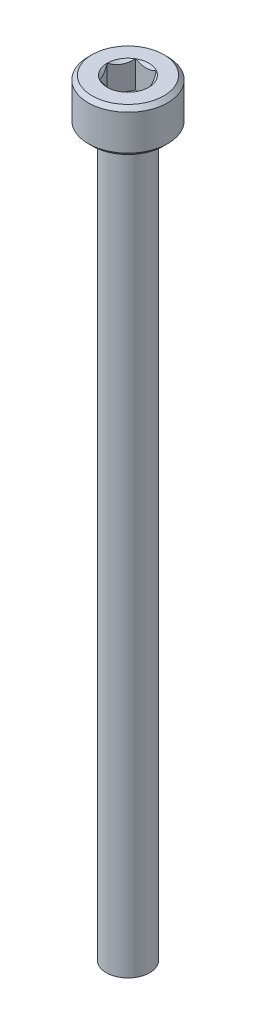
ISO-10303-21;
HEADER;
FILE_DESCRIPTION(('STEP AP214'),'2;1');
FILE_NAME('part.step','',(''),(''),'','','');
FILE_SCHEMA(('AUTOMOTIVE_DESIGN { 1 0 10303 214 1 1 1 1 }'));
ENDSEC;
DATA;
#1=APPLICATION_CONTEXT('core data for automotive mechanical design processes');
#2=APPLICATION_PROTOCOL_DEFINITION('international standard','automotive_design',2000,#1);
#3=PRODUCT_CONTEXT('',#1,'mechanical');
#4=PRODUCT('Part','Part','',(#3));
#5=PRODUCT_RELATED_PRODUCT_CATEGORY('part','',(#4));
#6=PRODUCT_DEFINITION_FORMATION('','',#4);
#7=PRODUCT_DEFINITION_CONTEXT('part definition',#1,'design');
#8=PRODUCT_DEFINITION('design','',#6,#7);
#9=PRODUCT_DEFINITION_SHAPE('','',#8);
#10=(LENGTH_UNIT() NAMED_UNIT(*) SI_UNIT(.MILLI.,.METRE.));
#11=(NAMED_UNIT(*) PLANE_ANGLE_UNIT() SI_UNIT($,.RADIAN.));
#12=(NAMED_UNIT(*) SI_UNIT($,.STERADIAN.) SOLID_ANGLE_UNIT());
#13=UNCERTAINTY_MEASURE_WITH_UNIT(LENGTH_MEASURE(1.E-05),#10,'distance_accuracy_value','');
#14=(GEOMETRIC_REPRESENTATION_CONTEXT(3) GLOBAL_UNCERTAINTY_ASSIGNED_CONTEXT((#13)) GLOBAL_UNIT_ASSIGNED_CONTEXT((#10,
#11,#12)) REPRESENTATION_CONTEXT('',''));
#15=CARTESIAN_POINT('',(0.,0.,0.));
#16=DIRECTION('',(0.,0.,1.));
#17=DIRECTION('',(1.,0.,0.));
#18=AXIS2_PLACEMENT_3D('',#15,#16,#17);
#19=CARTESIAN_POINT('',(0.,3.,0.));
#20=DIRECTION('',(0.,-1.,0.));
#21=DIRECTION('',(0.,0.,-1.));
#22=AXIS2_PLACEMENT_3D('',#19,#20,#21);
#23=CYLINDRICAL_SURFACE('',#22,2.75);
#24=CARTESIAN_POINT('',(0.,0.275000000000001,0.));
#25=DIRECTION('',(0.,1.,0.));
#26=DIRECTION('',(0.,0.,1.));
#27=AXIS2_PLACEMENT_3D('',#24,#25,#26);
#28=CIRCLE('',#27,2.75);
#29=CARTESIAN_POINT('',(0.,0.275000000000001,2.75));
#30=VERTEX_POINT('',#29);
#31=EDGE_CURVE('E222',#30,#30,#28,.T.);
#32=ORIENTED_EDGE('',*,*,#31,.T.);
#33=EDGE_LOOP('',(#32));
#34=FACE_BOUND('',#33,.T.);
#35=CARTESIAN_POINT('',(0.,2.725,0.));
#36=DIRECTION('',(0.,1.,0.));
#37=DIRECTION('',(0.,0.,1.));
#38=AXIS2_PLACEMENT_3D('',#35,#36,#37);
#39=CIRCLE('',#38,2.75);
#40=CARTESIAN_POINT('',(0.,2.725,2.75));
#41=VERTEX_POINT('',#40);
#42=EDGE_CURVE('E105',#41,#41,#39,.F.);
#43=ORIENTED_EDGE('',*,*,#42,.T.);
#44=EDGE_LOOP('',(#43));
#45=FACE_BOUND('',#44,.T.);
#46=ADVANCED_FACE('F33',(#34,#45),#23,.T.);
#47=CARTESIAN_POINT('',(0.,3.,0.));
#48=DIRECTION('',(0.,1.,0.));
#49=DIRECTION('',(0.,0.,1.));
#50=AXIS2_PLACEMENT_3D('',#47,#48,#49);
#51=PLANE('',#50);
#52=CARTESIAN_POINT('',(0.,3.,0.));
#53=DIRECTION('',(0.,1.,0.));
#54=DIRECTION('',(0.,0.,1.));
#55=AXIS2_PLACEMENT_3D('',#52,#53,#54);
#56=CIRCLE('',#55,2.475);
#57=CARTESIAN_POINT('',(0.,3.,2.475));
#58=VERTEX_POINT('',#57);
#59=EDGE_CURVE('E37',#58,#58,#56,.T.);
#60=ORIENTED_EDGE('',*,*,#59,.T.);
#61=EDGE_LOOP('',(#60));
#62=FACE_BOUND('',#61,.T.);
#63=CARTESIAN_POINT('',(0.,3.,0.));
#64=DIRECTION('',(0.,1.,0.));
#65=DIRECTION('',(0.,0.,1.));
#66=AXIS2_PLACEMENT_3D('',#63,#64,#65);
#67=CIRCLE('',#66,1.44337567297406);
#68=CARTESIAN_POINT('',(0.721687836487033,3.,1.25));
#69=VERTEX_POINT('',#68);
#70=CARTESIAN_POINT('',(1.44337567297406,3.,0.));
#71=VERTEX_POINT('',#70);
#72=EDGE_CURVE('E48',#69,#71,#67,.T.);
#73=ORIENTED_EDGE('',*,*,#72,.F.);
#74=CARTESIAN_POINT('',(-0.721687836487033,3.,1.25));
#75=VERTEX_POINT('',#74);
#76=EDGE_CURVE('E55',#75,#69,#67,.T.);
#77=ORIENTED_EDGE('',*,*,#76,.F.);
#78=CARTESIAN_POINT('',(-1.44337567297406,3.,0.));
#79=VERTEX_POINT('',#78);
#80=EDGE_CURVE('E128',#79,#75,#67,.T.);
#81=ORIENTED_EDGE('',*,*,#80,.F.);
#82=CARTESIAN_POINT('',(-0.721687836487033,3.,-1.25));
#83=VERTEX_POINT('',#82);
#84=EDGE_CURVE('E127',#83,#79,#67,.T.);
#85=ORIENTED_EDGE('',*,*,#84,.F.);
#86=CARTESIAN_POINT('',(0.721687836487032,3.,-1.25));
#87=VERTEX_POINT('',#86);
#88=EDGE_CURVE('E95',#87,#83,#67,.T.);
#89=ORIENTED_EDGE('',*,*,#88,.F.);
#90=EDGE_CURVE('E87',#71,#87,#67,.T.);
#91=ORIENTED_EDGE('',*,*,#90,.F.);
#92=EDGE_LOOP('',(#73,#77,#81,#85,#89,#91));
#93=FACE_BOUND('',#92,.T.);
#94=ADVANCED_FACE('F125',(#62,#93),#51,.T.);
#95=CARTESIAN_POINT('',(0.,0.,0.));
#96=DIRECTION('',(0.,1.,0.));
#97=DIRECTION('',(0.,0.,1.));
#98=AXIS2_PLACEMENT_3D('',#95,#96,#97);
#99=PLANE('',#98);
#100=CARTESIAN_POINT('',(0.,0.,0.));
#101=DIRECTION('',(0.,-1.,0.));
#102=DIRECTION('',(0.,0.,-1.));
#103=AXIS2_PLACEMENT_3D('',#100,#101,#102);
#104=CIRCLE('',#103,1.5);
#105=CARTESIAN_POINT('',(0.,0.,-1.5));
#106=VERTEX_POINT('',#105);
#107=EDGE_CURVE('E11',#106,#106,#104,.T.);
#108=ORIENTED_EDGE('',*,*,#107,.F.);
#109=EDGE_LOOP('',(#108));
#110=FACE_BOUND('',#109,.T.);
#111=CARTESIAN_POINT('',(0.,0.,0.));
#112=DIRECTION('',(0.,1.,0.));
#113=DIRECTION('',(0.,0.,1.));
#114=AXIS2_PLACEMENT_3D('',#111,#112,#113);
#115=CIRCLE('',#114,2.475);
#116=CARTESIAN_POINT('',(0.,0.,2.475));
#117=VERTEX_POINT('',#116);
#118=EDGE_CURVE('E220',#117,#117,#115,.F.);
#119=ORIENTED_EDGE('',*,*,#118,.T.);
#120=EDGE_LOOP('',(#119));
#121=FACE_BOUND('',#120,.T.);
#122=ADVANCED_FACE('F203',(#110,#121),#99,.F.);
#123=CARTESIAN_POINT('',(0.,3.,0.));
#124=DIRECTION('',(0.,1.,0.));
#125=DIRECTION('',(0.,0.,1.));
#126=AXIS2_PLACEMENT_3D('',#123,#124,#125);
#127=CONICAL_SURFACE('',#126,1.44337567297406,0.78539816339745);
#128=ORIENTED_EDGE('',*,*,#88,.T.);
#129=CARTESIAN_POINT('',(-1.43934010808077,3.46298209689233,-1.25));
#130=CARTESIAN_POINT('',(-1.40429313005659,3.43652492263289,-1.25));
#131=CARTESIAN_POINT('',(-1.36905087135599,3.41032716035428,-1.25));
#132=CARTESIAN_POINT('',(-1.29809650706311,3.35855757183958,-1.25));
#133=CARTESIAN_POINT('',(-1.26238428576495,3.33298590435629,-1.25));
#134=CARTESIAN_POINT('',(-1.15390111792708,3.25700599368946,-1.25));
#135=CARTESIAN_POINT('',(-1.08031646726264,3.20774028618957,-1.25));
#136=CARTESIAN_POINT('',(-0.926012322755095,3.11102583026313,-1.25));
#137=CARTESIAN_POINT('',(-0.845125318656146,3.0638412989418,-1.25));
#138=CARTESIAN_POINT('',(-0.679311174076602,2.97753073439041,-1.25));
#139=CARTESIAN_POINT('',(-0.594398891026688,2.9383775346269,-1.25));
#140=CARTESIAN_POINT('',(-0.466944812460741,2.89047722368829,-1.25));
#141=CARTESIAN_POINT('',(-0.426289985812822,2.87672948978634,-1.25));
#142=CARTESIAN_POINT('',(-0.343998850091268,2.85249792745054,-1.25));
#143=CARTESIAN_POINT('',(-0.302362473614962,2.84201432386977,-1.25));
#144=CARTESIAN_POINT('',(-0.219052696285666,2.8250301617483,-1.25));
#145=CARTESIAN_POINT('',(-0.1773934284745,2.81846136047137,-1.25));
#146=CARTESIAN_POINT('',(-0.0936293693401924,2.80943505345776,-1.25));
#147=CARTESIAN_POINT('',(-0.0515246558543963,2.80697684099727,-1.25));
#148=CARTESIAN_POINT('',(0.0311890576306314,2.80635406201328,-1.25));
#149=CARTESIAN_POINT('',(0.0717969625499302,2.80803711684625,-1.25));
#150=CARTESIAN_POINT('',(0.152668636885197,2.81526827059791,-1.25));
#151=CARTESIAN_POINT('',(0.192932338835358,2.82081711041311,-1.25));
#152=CARTESIAN_POINT('',(0.273499879165295,2.83557103646495,-1.25));
#153=CARTESIAN_POINT('',(0.313792180618511,2.8448381759641,-1.25));
#154=CARTESIAN_POINT('',(0.393496413911457,2.86653617845735,-1.25));
#155=CARTESIAN_POINT('',(0.432908419115059,2.87896677673064,-1.25));
#156=CARTESIAN_POINT('',(0.556992735862298,2.92277935293144,-1.25));
#157=CARTESIAN_POINT('',(0.639898924666085,2.95915107287596,-1.25));
#158=CARTESIAN_POINT('',(0.801816555499701,3.04001916217833,-1.25));
#159=CARTESIAN_POINT('',(0.880812666325045,3.08454472091199,-1.25));
#160=CARTESIAN_POINT('',(1.0317856127975,3.17640487666662,-1.25));
#161=CARTESIAN_POINT('',(1.10391618485086,3.22348993391625,-1.25));
#162=CARTESIAN_POINT('',(1.21018606043311,3.29627856159854,-1.25));
#163=CARTESIAN_POINT('',(1.24515069969379,3.32079808539336,-1.25));
#164=CARTESIAN_POINT('',(1.31460220852736,3.37048563676568,-1.25));
#165=CARTESIAN_POINT('',(1.34908920596618,3.39565348541552,-1.25));
#166=CARTESIAN_POINT('',(1.38337731682912,3.42109014884121,-1.25));
#167=B_SPLINE_CURVE_WITH_KNOTS('',3,(#129,#130,#131,#132,#133,#134,#135,#136,#137,#138,#139,
#140,#141,#142,#143,#144,#145,#146,#147,#148,#149,#150,#151,#152,#153,#154,#155,#156,#157,#158,
#159,#160,#161,#162,#163,#164,#165,#166),.UNSPECIFIED.,.F.,.F.,(4,2,2,2,2,2,2,2,2,2,2,2,2,2,2,2,
2,2,4),(0.,0.131732960381448,0.263498984161645,0.529042014455825,0.809741926134617,
1.08947609717225,1.21811634272576,1.346765447839,1.47310084517844,1.59941451973784,
1.72115042167849,1.84290966131735,1.96679153905341,2.09066305366039,2.36146692896009,
2.63325989198491,2.89154668212279,3.01965734507713,3.14773302245628),.UNSPECIFIED.);
#168=EDGE_CURVE('E100',#87,#83,#167,.F.);
#169=ORIENTED_EDGE('',*,*,#168,.F.);
#170=EDGE_LOOP('',(#128,#169));
#171=FACE_BOUND('',#170,.T.);
#172=ADVANCED_FACE('F101',(#171),#127,.F.);
#173=ORIENTED_EDGE('',*,*,#84,.T.);
#174=CARTESIAN_POINT('',(-0.721572366433195,3.00011548390914,-1.2502));
#175=CARTESIAN_POINT('',(-0.746384090710444,2.9753216680551,-1.20722483292841));
#176=CARTESIAN_POINT('',(-0.771610739653664,2.95198373441868,-1.16353099525405));
#177=CARTESIAN_POINT('',(-0.823050873919155,2.90925200408454,-1.07443406915806));
#178=CARTESIAN_POINT('',(-0.849269254648333,2.88988199236041,-1.02902250164294));
#179=CARTESIAN_POINT('',(-0.902137405038635,2.85670048341348,-0.937452179064741));
#180=CARTESIAN_POINT('',(-0.928773701756387,2.84280555905266,-0.891316759824115));
#181=CARTESIAN_POINT('',(-0.982632884076012,2.82139728216064,-0.798029919592408));
#182=CARTESIAN_POINT('',(-1.00985412292348,2.81386794156679,-0.750881350863621));
#183=CARTESIAN_POINT('',(-1.05676666578643,2.8070744980507,-0.669626443112748));
#184=CARTESIAN_POINT('',(-1.07639733689152,2.80606855910435,-0.63562512337206));
#185=CARTESIAN_POINT('',(-1.11562418145499,2.80776141491132,-0.567682235567523));
#186=CARTESIAN_POINT('',(-1.1352203463451,2.81046102721554,-0.533740682344343));
#187=CARTESIAN_POINT('',(-1.1742235548576,2.81940893031638,-0.466185143542501));
#188=CARTESIAN_POINT('',(-1.19363040521233,2.82566052589971,-0.432571492713226));
#189=CARTESIAN_POINT('',(-1.23212011385119,2.8413756814139,-0.365905361782188));
#190=CARTESIAN_POINT('',(-1.2512028293628,2.85084062008746,-0.332853128969705));
#191=CARTESIAN_POINT('',(-1.30007715810653,2.87893139068759,-0.248200308399736));
#192=CARTESIAN_POINT('',(-1.32956058931202,2.8996701574522,-0.197133507570362));
#193=CARTESIAN_POINT('',(-1.38737318998519,2.94638713467148,-0.0969991458867452));
#194=CARTESIAN_POINT('',(-1.41570576386268,2.97234829594677,-0.0479256884217304));
#195=CARTESIAN_POINT('',(-1.4434911430279,3.00011548390914,0.000200000000000358));
#196=B_SPLINE_CURVE_WITH_KNOTS('',3,(#174,#175,#176,#177,#178,#179,#180,#181,#182,#183,#184,
#185,#186,#187,#188,#189,#190,#191,#192,#193,#194,#195),.UNSPECIFIED.,.F.,.F.,(4,2,2,2,2,2,2,2,
2,2,4),(0.,0.166533409618303,0.334037607289761,0.498880396489697,0.663307919240274,
0.780963963458826,0.898645970148452,1.01643764860773,1.13427993171549,1.32148652032141,
1.50809158792574),.UNSPECIFIED.);
#197=EDGE_CURVE('E130',#83,#79,#196,.T.);
#198=ORIENTED_EDGE('',*,*,#197,.F.);
#199=EDGE_LOOP('',(#173,#198));
#200=FACE_BOUND('',#199,.T.);
#201=ADVANCED_FACE('F237',(#200),#127,.F.);
#202=ORIENTED_EDGE('',*,*,#80,.T.);
#203=CARTESIAN_POINT('',(-1.4434911430279,3.00011548390914,-0.000199999999999785));
#204=CARTESIAN_POINT('',(-1.41867941875065,2.9753216680551,0.0427751670715869));
#205=CARTESIAN_POINT('',(-1.39345276980743,2.95198373441868,0.0864690047459481));
#206=CARTESIAN_POINT('',(-1.34201263554194,2.90925200408454,0.175565930841942));
#207=CARTESIAN_POINT('',(-1.31579425481276,2.88988199236041,0.220977498357064));
#208=CARTESIAN_POINT('',(-1.26292610442246,2.85670048341348,0.31254782093526));
#209=CARTESIAN_POINT('',(-1.23628980770471,2.84280555905266,0.358683240175886));
#210=CARTESIAN_POINT('',(-1.18243062538508,2.82139728216064,0.451970080407593));
#211=CARTESIAN_POINT('',(-1.15520938653761,2.81386794156679,0.49911864913638));
#212=CARTESIAN_POINT('',(-1.10829684367467,2.8070744980507,0.580373556887253));
#213=CARTESIAN_POINT('',(-1.08866617256958,2.80606855910435,0.614374876627941));
#214=CARTESIAN_POINT('',(-1.04943932800611,2.80776141491132,0.682317764432478));
#215=CARTESIAN_POINT('',(-1.02984316311599,2.81046102721554,0.716259317655658));
#216=CARTESIAN_POINT('',(-0.990839954603499,2.81940893031638,0.7838148564575));
#217=CARTESIAN_POINT('',(-0.971433104248771,2.82566052589971,0.817428507286775));
#218=CARTESIAN_POINT('',(-0.932943395609905,2.8413756814139,0.884094638217813));
#219=CARTESIAN_POINT('',(-0.9138606800983,2.85084062008746,0.917146871030296));
#220=CARTESIAN_POINT('',(-0.864986351354568,2.87893139068759,1.00179969160026));
#221=CARTESIAN_POINT('',(-0.835502920149076,2.8996701574522,1.05286649242964));
#222=CARTESIAN_POINT('',(-0.777690319475909,2.94638713467148,1.15300085411325));
#223=CARTESIAN_POINT('',(-0.749357745598417,2.97234829594677,1.20207431157827));
#224=CARTESIAN_POINT('',(-0.721572366433195,3.00011548390914,1.2502));
#225=B_SPLINE_CURVE_WITH_KNOTS('',3,(#203,#204,#205,#206,#207,#208,#209,#210,#211,#212,#213,
#214,#215,#216,#217,#218,#219,#220,#221,#222,#223,#224),.UNSPECIFIED.,.F.,.F.,(4,2,2,2,2,2,2,2,
2,2,4),(0.,0.166533409618303,0.334037607289761,0.498880396489698,0.663307919240275,
0.780963963458827,0.898645970148453,1.01643764860773,1.1342799317155,1.32148652032141,
1.50809158792573),.UNSPECIFIED.);
#226=EDGE_CURVE('E139',#79,#75,#225,.T.);
#227=ORIENTED_EDGE('',*,*,#226,.F.);
#228=EDGE_LOOP('',(#202,#227));
#229=FACE_BOUND('',#228,.T.);
#230=ADVANCED_FACE('F252',(#229),#127,.F.);
#231=ORIENTED_EDGE('',*,*,#76,.T.);
#232=CARTESIAN_POINT('',(-1.43934010808077,3.46298209689233,1.25));
#233=CARTESIAN_POINT('',(-1.40429313005659,3.43652492263289,1.25));
#234=CARTESIAN_POINT('',(-1.36905087135599,3.41032716035428,1.25));
#235=CARTESIAN_POINT('',(-1.29809650706311,3.35855757183958,1.25));
#236=CARTESIAN_POINT('',(-1.26238428576495,3.33298590435629,1.25));
#237=CARTESIAN_POINT('',(-1.15390111792708,3.25700599368946,1.25));
#238=CARTESIAN_POINT('',(-1.08031646726264,3.20774028618957,1.25));
#239=CARTESIAN_POINT('',(-0.926012322755096,3.11102583026313,1.25));
#240=CARTESIAN_POINT('',(-0.845125318656147,3.0638412989418,1.25));
#241=CARTESIAN_POINT('',(-0.679311174076603,2.97753073439041,1.25));
#242=CARTESIAN_POINT('',(-0.594398891026688,2.9383775346269,1.25));
#243=CARTESIAN_POINT('',(-0.46694481246074,2.89047722368829,1.25));
#244=CARTESIAN_POINT('',(-0.426289985812822,2.87672948978634,1.25));
#245=CARTESIAN_POINT('',(-0.343998850091268,2.85249792745054,1.25));
#246=CARTESIAN_POINT('',(-0.302362473614962,2.84201432386977,1.25));
#247=CARTESIAN_POINT('',(-0.219052696285665,2.8250301617483,1.25));
#248=CARTESIAN_POINT('',(-0.1773934284745,2.81846136047137,1.25));
#249=CARTESIAN_POINT('',(-0.0936293693401921,2.80943505345776,1.25));
#250=CARTESIAN_POINT('',(-0.051524655854396,2.80697684099727,1.25));
#251=CARTESIAN_POINT('',(0.0311890576306315,2.80635406201328,1.25));
#252=CARTESIAN_POINT('',(0.0717969625499303,2.80803711684625,1.25));
#253=CARTESIAN_POINT('',(0.152668636885197,2.81526827059791,1.25));
#254=CARTESIAN_POINT('',(0.192932338835358,2.82081711041311,1.25));
#255=CARTESIAN_POINT('',(0.273499879165295,2.83557103646495,1.25));
#256=CARTESIAN_POINT('',(0.313792180618511,2.8448381759641,1.25));
#257=CARTESIAN_POINT('',(0.393496413911457,2.86653617845735,1.25));
#258=CARTESIAN_POINT('',(0.432908419115059,2.87896677673064,1.25));
#259=CARTESIAN_POINT('',(0.556992735862298,2.92277935293144,1.25));
#260=CARTESIAN_POINT('',(0.639898924666085,2.95915107287595,1.25));
#261=CARTESIAN_POINT('',(0.801816555499701,3.04001916217833,1.25));
#262=CARTESIAN_POINT('',(0.880812666325044,3.08454472091198,1.25));
#263=CARTESIAN_POINT('',(1.0317856127975,3.17640487666662,1.25));
#264=CARTESIAN_POINT('',(1.10391618485086,3.22348993391625,1.25));
#265=CARTESIAN_POINT('',(1.2101860604331,3.29627856159854,1.25));
#266=CARTESIAN_POINT('',(1.24515069969379,3.32079808539336,1.25));
#267=CARTESIAN_POINT('',(1.31460220852736,3.37048563676568,1.25));
#268=CARTESIAN_POINT('',(1.34908920596618,3.39565348541552,1.25));
#269=CARTESIAN_POINT('',(1.38337731682911,3.42109014884121,1.25));
#270=B_SPLINE_CURVE_WITH_KNOTS('',3,(#232,#233,#234,#235,#236,#237,#238,#239,#240,#241,#242,
#243,#244,#245,#246,#247,#248,#249,#250,#251,#252,#253,#254,#255,#256,#257,#258,#259,#260,#261,
#262,#263,#264,#265,#266,#267,#268,#269),.UNSPECIFIED.,.F.,.F.,(4,2,2,2,2,2,2,2,2,2,2,2,2,2,2,2,
2,2,4),(0.,0.131732960381448,0.263498984161645,0.529042014455826,0.809741926134619,
1.08947609717225,1.21811634272577,1.34676544783901,1.47310084517844,1.59941451973785,
1.7211504216785,1.84290966131735,1.96679153905342,2.09066305366039,2.36146692896009,
2.63325989198491,2.89154668212279,3.01965734507713,3.14773302245628),.UNSPECIFIED.);
#271=EDGE_CURVE('E166',#75,#69,#270,.T.);
#272=ORIENTED_EDGE('',*,*,#271,.F.);
#273=EDGE_LOOP('',(#231,#272));
#274=FACE_BOUND('',#273,.T.);
#275=ADVANCED_FACE('F282',(#274),#127,.F.);
#276=ORIENTED_EDGE('',*,*,#72,.T.);
#277=CARTESIAN_POINT('',(0.721572366433194,3.00011548390914,1.2502));
#278=CARTESIAN_POINT('',(0.746384090710444,2.9753216680551,1.20722483292841));
#279=CARTESIAN_POINT('',(0.771610739653664,2.95198373441868,1.16353099525405));
#280=CARTESIAN_POINT('',(0.823050873919154,2.90925200408454,1.07443406915806));
#281=CARTESIAN_POINT('',(0.849269254648333,2.88988199236041,1.02902250164294));
#282=CARTESIAN_POINT('',(0.902137405038635,2.85670048341348,0.93745217906474));
#283=CARTESIAN_POINT('',(0.928773701756386,2.84280555905266,0.891316759824115));
#284=CARTESIAN_POINT('',(0.982632884076012,2.82139728216064,0.798029919592408));
#285=CARTESIAN_POINT('',(1.00985412292348,2.81386794156679,0.750881350863621));
#286=CARTESIAN_POINT('',(1.05676666578643,2.8070744980507,0.669626443112748));
#287=CARTESIAN_POINT('',(1.07639733689152,2.80606855910435,0.63562512337206));
#288=CARTESIAN_POINT('',(1.11562418145499,2.80776141491132,0.567682235567523));
#289=CARTESIAN_POINT('',(1.1352203463451,2.81046102721554,0.533740682344343));
#290=CARTESIAN_POINT('',(1.1742235548576,2.81940893031638,0.466185143542501));
#291=CARTESIAN_POINT('',(1.19363040521232,2.8256605258997,0.432571492713226));
#292=CARTESIAN_POINT('',(1.23212011385119,2.8413756814139,0.365905361782188));
#293=CARTESIAN_POINT('',(1.2512028293628,2.85084062008746,0.332853128969705));
#294=CARTESIAN_POINT('',(1.30007715810653,2.87893139068759,0.248200308399736));
#295=CARTESIAN_POINT('',(1.32956058931202,2.8996701574522,0.197133507570362));
#296=CARTESIAN_POINT('',(1.38737318998519,2.94638713467148,0.096999145886745));
#297=CARTESIAN_POINT('',(1.41570576386268,2.97234829594677,0.04792568842173));
#298=CARTESIAN_POINT('',(1.4434911430279,3.00011548390914,-0.000200000000000782));
#299=B_SPLINE_CURVE_WITH_KNOTS('',3,(#277,#278,#279,#280,#281,#282,#283,#284,#285,#286,#287,
#288,#289,#290,#291,#292,#293,#294,#295,#296,#297,#298),.UNSPECIFIED.,.F.,.F.,(4,2,2,2,2,2,2,2,
2,2,4),(0.,0.166533409618303,0.334037607289761,0.498880396489697,0.663307919240274,
0.780963963458826,0.898645970148452,1.01643764860773,1.13427993171549,1.32148652032141,
1.50809158792574),.UNSPECIFIED.);
#300=EDGE_CURVE('E115',#69,#71,#299,.T.);
#301=ORIENTED_EDGE('',*,*,#300,.F.);
#302=EDGE_LOOP('',(#276,#301));
#303=FACE_BOUND('',#302,.T.);
#304=ADVANCED_FACE('F153',(#303),#127,.F.);
#305=ORIENTED_EDGE('',*,*,#90,.T.);
#306=CARTESIAN_POINT('',(1.4434911430279,3.00011548390914,0.000199999999999333));
#307=CARTESIAN_POINT('',(1.41867941875065,2.9753216680551,-0.0427751670715874));
#308=CARTESIAN_POINT('',(1.39345276980743,2.95198373441868,-0.0864690047459486));
#309=CARTESIAN_POINT('',(1.34201263554194,2.90925200408454,-0.175565930841942));
#310=CARTESIAN_POINT('',(1.31579425481276,2.88988199236041,-0.220977498357064));
#311=CARTESIAN_POINT('',(1.26292610442246,2.85670048341348,-0.31254782093526));
#312=CARTESIAN_POINT('',(1.23628980770471,2.84280555905266,-0.358683240175886));
#313=CARTESIAN_POINT('',(1.18243062538508,2.82139728216064,-0.451970080407593));
#314=CARTESIAN_POINT('',(1.15520938653761,2.81386794156679,-0.49911864913638));
#315=CARTESIAN_POINT('',(1.10829684367467,2.8070744980507,-0.580373556887252));
#316=CARTESIAN_POINT('',(1.08866617256958,2.80606855910435,-0.614374876627941));
#317=CARTESIAN_POINT('',(1.04943932800611,2.80776141491132,-0.682317764432477));
#318=CARTESIAN_POINT('',(1.02984316311599,2.81046102721554,-0.716259317655657));
#319=CARTESIAN_POINT('',(0.990839954603499,2.81940893031638,-0.783814856457499));
#320=CARTESIAN_POINT('',(0.971433104248771,2.82566052589971,-0.817428507286775));
#321=CARTESIAN_POINT('',(0.932943395609905,2.8413756814139,-0.884094638217813));
#322=CARTESIAN_POINT('',(0.9138606800983,2.85084062008746,-0.917146871030295));
#323=CARTESIAN_POINT('',(0.864986351354567,2.87893139068759,-1.00179969160026));
#324=CARTESIAN_POINT('',(0.835502920149075,2.8996701574522,-1.05286649242964));
#325=CARTESIAN_POINT('',(0.777690319475908,2.94638713467148,-1.15300085411326));
#326=CARTESIAN_POINT('',(0.749357745598416,2.97234829594677,-1.20207431157827));
#327=CARTESIAN_POINT('',(0.721572366433194,3.00011548390914,-1.2502));
#328=B_SPLINE_CURVE_WITH_KNOTS('',3,(#306,#307,#308,#309,#310,#311,#312,#313,#314,#315,#316,
#317,#318,#319,#320,#321,#322,#323,#324,#325,#326,#327),.UNSPECIFIED.,.F.,.F.,(4,2,2,2,2,2,2,2,
2,2,4),(0.,0.166533409618303,0.334037607289761,0.498880396489698,0.663307919240274,
0.780963963458826,0.898645970148452,1.01643764860773,1.13427993171549,1.32148652032141,
1.50809158792574),.UNSPECIFIED.);
#329=EDGE_CURVE('E91',#71,#87,#328,.T.);
#330=ORIENTED_EDGE('',*,*,#329,.F.);
#331=EDGE_LOOP('',(#305,#330));
#332=FACE_BOUND('',#331,.T.);
#333=ADVANCED_FACE('F89',(#332),#127,.F.);
#334=CARTESIAN_POINT('',(0.,1.12,0.));
#335=DIRECTION('',(0.,1.,0.));
#336=DIRECTION('',(0.,0.,1.));
#337=AXIS2_PLACEMENT_3D('',#334,#335,#336);
#338=PLANE('',#337);
#339=DIRECTION('',(-0.5,0.,-0.866025403784438));
#340=VECTOR('',#339,1.);
#341=CARTESIAN_POINT('',(1.44337567297406,1.12,0.));
#342=LINE('',#341,#340);
#343=CARTESIAN_POINT('',(1.44337567297406,1.12,0.));
#344=VERTEX_POINT('',#343);
#345=CARTESIAN_POINT('',(0.721687836487032,1.12,-1.25));
#346=VERTEX_POINT('',#345);
#347=EDGE_CURVE('E114',#344,#346,#342,.T.);
#348=ORIENTED_EDGE('',*,*,#347,.T.);
#349=DIRECTION('',(-1.,0.,0.));
#350=VECTOR('',#349,1.);
#351=CARTESIAN_POINT('',(0.721687836487032,1.12,-1.25));
#352=LINE('',#351,#350);
#353=CARTESIAN_POINT('',(-0.721687836487032,1.12,-1.25));
#354=VERTEX_POINT('',#353);
#355=EDGE_CURVE('E119',#346,#354,#352,.T.);
#356=ORIENTED_EDGE('',*,*,#355,.T.);
#357=DIRECTION('',(-0.5,0.,0.866025403784439));
#358=VECTOR('',#357,1.);
#359=CARTESIAN_POINT('',(-0.721687836487032,1.12,-1.25));
#360=LINE('',#359,#358);
#361=CARTESIAN_POINT('',(-1.44337567297406,1.12,0.));
#362=VERTEX_POINT('',#361);
#363=EDGE_CURVE('E276',#354,#362,#360,.T.);
#364=ORIENTED_EDGE('',*,*,#363,.T.);
#365=DIRECTION('',(0.5,0.,0.866025403784439));
#366=VECTOR('',#365,1.);
#367=CARTESIAN_POINT('',(-1.44337567297406,1.12,0.));
#368=LINE('',#367,#366);
#369=CARTESIAN_POINT('',(-0.721687836487033,1.12,1.25));
#370=VERTEX_POINT('',#369);
#371=EDGE_CURVE('E259',#362,#370,#368,.T.);
#372=ORIENTED_EDGE('',*,*,#371,.T.);
#373=DIRECTION('',(1.,0.,0.));
#374=VECTOR('',#373,1.);
#375=CARTESIAN_POINT('',(-0.721687836487033,1.12,1.25));
#376=LINE('',#375,#374);
#377=CARTESIAN_POINT('',(0.721687836487032,1.12,1.25));
#378=VERTEX_POINT('',#377);
#379=EDGE_CURVE('E272',#370,#378,#376,.T.);
#380=ORIENTED_EDGE('',*,*,#379,.T.);
#381=DIRECTION('',(0.5,0.,-0.866025403784439));
#382=VECTOR('',#381,1.);
#383=CARTESIAN_POINT('',(0.721687836487032,1.12,1.25));
#384=LINE('',#383,#382);
#385=EDGE_CURVE('E122',#378,#344,#384,.T.);
#386=ORIENTED_EDGE('',*,*,#385,.T.);
#387=EDGE_LOOP('',(#348,#356,#364,#372,#380,#386));
#388=FACE_BOUND('',#387,.T.);
#389=ADVANCED_FACE('F152',(#388),#338,.T.);
#390=CARTESIAN_POINT('',(0.721687836487032,1.12,-1.25));
#391=DIRECTION('',(0.,0.,-1.));
#392=DIRECTION('',(-1.,0.,0.));
#393=AXIS2_PLACEMENT_3D('',#390,#391,#392);
#394=PLANE('',#393);
#395=DIRECTION('',(0.,1.,0.));
#396=VECTOR('',#395,1.);
#397=CARTESIAN_POINT('',(0.721687836487032,1.12,-1.25));
#398=LINE('',#397,#396);
#399=EDGE_CURVE('E112',#346,#87,#398,.T.);
#400=ORIENTED_EDGE('',*,*,#399,.T.);
#401=ORIENTED_EDGE('',*,*,#168,.T.);
#402=DIRECTION('',(0.,1.,0.));
#403=VECTOR('',#402,1.);
#404=CARTESIAN_POINT('',(-0.721687836487032,1.12,-1.25));
#405=LINE('',#404,#403);
#406=EDGE_CURVE('E121',#354,#83,#405,.T.);
#407=ORIENTED_EDGE('',*,*,#406,.F.);
#408=ORIENTED_EDGE('',*,*,#355,.F.);
#409=EDGE_LOOP('',(#400,#401,#407,#408));
#410=FACE_BOUND('',#409,.T.);
#411=ADVANCED_FACE('F117',(#410),#394,.F.);
#412=CARTESIAN_POINT('',(-0.721687836487032,1.12,-1.25));
#413=DIRECTION('',(-0.866025403784439,0.,-0.5));
#414=DIRECTION('',(-0.5,0.,0.866025403784439));
#415=AXIS2_PLACEMENT_3D('',#412,#413,#414);
#416=PLANE('',#415);
#417=ORIENTED_EDGE('',*,*,#406,.T.);
#418=ORIENTED_EDGE('',*,*,#197,.T.);
#419=DIRECTION('',(0.,1.,0.));
#420=VECTOR('',#419,1.);
#421=CARTESIAN_POINT('',(-1.44337567297406,1.12,0.));
#422=LINE('',#421,#420);
#423=EDGE_CURVE('E255',#362,#79,#422,.T.);
#424=ORIENTED_EDGE('',*,*,#423,.F.);
#425=ORIENTED_EDGE('',*,*,#363,.F.);
#426=EDGE_LOOP('',(#417,#418,#424,#425));
#427=FACE_BOUND('',#426,.T.);
#428=ADVANCED_FACE('F145',(#427),#416,.F.);
#429=CARTESIAN_POINT('',(-1.44337567297406,1.12,0.));
#430=DIRECTION('',(-0.866025403784439,0.,0.5));
#431=DIRECTION('',(0.5,0.,0.866025403784439));
#432=AXIS2_PLACEMENT_3D('',#429,#430,#431);
#433=PLANE('',#432);
#434=ORIENTED_EDGE('',*,*,#423,.T.);
#435=ORIENTED_EDGE('',*,*,#226,.T.);
#436=DIRECTION('',(0.,1.,0.));
#437=VECTOR('',#436,1.);
#438=CARTESIAN_POINT('',(-0.721687836487033,1.12,1.25));
#439=LINE('',#438,#437);
#440=EDGE_CURVE('E261',#370,#75,#439,.T.);
#441=ORIENTED_EDGE('',*,*,#440,.F.);
#442=ORIENTED_EDGE('',*,*,#371,.F.);
#443=EDGE_LOOP('',(#434,#435,#441,#442));
#444=FACE_BOUND('',#443,.T.);
#445=ADVANCED_FACE('F187',(#444),#433,.F.);
#446=CARTESIAN_POINT('',(-0.721687836487033,1.12,1.25));
#447=DIRECTION('',(0.,0.,1.));
#448=DIRECTION('',(1.,0.,0.));
#449=AXIS2_PLACEMENT_3D('',#446,#447,#448);
#450=PLANE('',#449);
#451=ORIENTED_EDGE('',*,*,#440,.T.);
#452=ORIENTED_EDGE('',*,*,#271,.T.);
#453=DIRECTION('',(0.,1.,0.));
#454=VECTOR('',#453,1.);
#455=CARTESIAN_POINT('',(0.721687836487032,1.12,1.25));
#456=LINE('',#455,#454);
#457=EDGE_CURVE('E263',#378,#69,#456,.T.);
#458=ORIENTED_EDGE('',*,*,#457,.F.);
#459=ORIENTED_EDGE('',*,*,#379,.F.);
#460=EDGE_LOOP('',(#451,#452,#458,#459));
#461=FACE_BOUND('',#460,.T.);
#462=ADVANCED_FACE('F183',(#461),#450,.F.);
#463=CARTESIAN_POINT('',(0.721687836487032,1.12,1.25));
#464=DIRECTION('',(0.866025403784439,0.,0.5));
#465=DIRECTION('',(0.5,0.,-0.866025403784439));
#466=AXIS2_PLACEMENT_3D('',#463,#464,#465);
#467=PLANE('',#466);
#468=ORIENTED_EDGE('',*,*,#457,.T.);
#469=ORIENTED_EDGE('',*,*,#300,.T.);
#470=DIRECTION('',(0.,1.,0.));
#471=VECTOR('',#470,1.);
#472=CARTESIAN_POINT('',(1.44337567297406,1.12,0.));
#473=LINE('',#472,#471);
#474=EDGE_CURVE('E106',#344,#71,#473,.T.);
#475=ORIENTED_EDGE('',*,*,#474,.F.);
#476=ORIENTED_EDGE('',*,*,#385,.F.);
#477=EDGE_LOOP('',(#468,#469,#475,#476));
#478=FACE_BOUND('',#477,.T.);
#479=ADVANCED_FACE('F180',(#478),#467,.F.);
#480=CARTESIAN_POINT('',(1.44337567297406,1.12,0.));
#481=DIRECTION('',(0.866025403784438,0.,-0.5));
#482=DIRECTION('',(-0.5,0.,-0.866025403784439));
#483=AXIS2_PLACEMENT_3D('',#480,#481,#482);
#484=PLANE('',#483);
#485=ORIENTED_EDGE('',*,*,#474,.T.);
#486=ORIENTED_EDGE('',*,*,#329,.T.);
#487=ORIENTED_EDGE('',*,*,#399,.F.);
#488=ORIENTED_EDGE('',*,*,#347,.F.);
#489=EDGE_LOOP('',(#485,#486,#487,#488));
#490=FACE_BOUND('',#489,.T.);
#491=ADVANCED_FACE('F110',(#490),#484,.F.);
#492=CARTESIAN_POINT('',(0.,0.275000000000001,0.));
#493=DIRECTION('',(0.,1.,0.));
#494=DIRECTION('',(0.,0.,1.));
#495=AXIS2_PLACEMENT_3D('',#492,#493,#494);
#496=CONICAL_SURFACE('',#495,2.75,0.785398163397451);
#497=ORIENTED_EDGE('',*,*,#118,.F.);
#498=EDGE_LOOP('',(#497));
#499=FACE_BOUND('',#498,.T.);
#500=ORIENTED_EDGE('',*,*,#31,.F.);
#501=EDGE_LOOP('',(#500));
#502=FACE_BOUND('',#501,.T.);
#503=ADVANCED_FACE('F209',(#499,#502),#496,.T.);
#504=CARTESIAN_POINT('',(0.,3.,0.));
#505=DIRECTION('',(0.,-1.,0.));
#506=DIRECTION('',(0.,0.,-1.));
#507=AXIS2_PLACEMENT_3D('',#504,#505,#506);
#508=CONICAL_SURFACE('',#507,2.475,0.785398163397447);
#509=ORIENTED_EDGE('',*,*,#42,.F.);
#510=EDGE_LOOP('',(#509));
#511=FACE_BOUND('',#510,.T.);
#512=ORIENTED_EDGE('',*,*,#59,.F.);
#513=EDGE_LOOP('',(#512));
#514=FACE_BOUND('',#513,.T.);
#515=ADVANCED_FACE('F35',(#511,#514),#508,.T.);
#516=CARTESIAN_POINT('',(0.,-50.,0.));
#517=DIRECTION('',(0.,1.,0.));
#518=DIRECTION('',(0.,0.,1.));
#519=AXIS2_PLACEMENT_3D('',#516,#517,#518);
#520=CYLINDRICAL_SURFACE('',#519,1.5);
#521=CARTESIAN_POINT('',(0.,-50.,0.));
#522=DIRECTION('',(0.,-1.,0.));
#523=DIRECTION('',(0.,0.,-1.));
#524=AXIS2_PLACEMENT_3D('',#521,#522,#523);
#525=CIRCLE('',#524,1.5);
#526=CARTESIAN_POINT('',(0.,-50.,-1.5));
#527=VERTEX_POINT('',#526);
#528=EDGE_CURVE('E248',#527,#527,#525,.T.);
#529=ORIENTED_EDGE('',*,*,#528,.F.);
#530=EDGE_LOOP('',(#529));
#531=FACE_BOUND('',#530,.T.);
#532=ORIENTED_EDGE('',*,*,#107,.T.);
#533=EDGE_LOOP('',(#532));
#534=FACE_BOUND('',#533,.T.);
#535=ADVANCED_FACE('F154',(#531,#534),#520,.T.);
#536=CARTESIAN_POINT('',(0.,-50.,0.));
#537=DIRECTION('',(0.,-1.,0.));
#538=DIRECTION('',(0.,0.,-1.));
#539=AXIS2_PLACEMENT_3D('',#536,#537,#538);
#540=PLANE('',#539);
#541=ORIENTED_EDGE('',*,*,#528,.T.);
#542=EDGE_LOOP('',(#541));
#543=FACE_BOUND('',#542,.T.);
#544=ADVANCED_FACE('F241',(#543),#540,.T.);
#545=CLOSED_SHELL('',(#46,#94,#122,#172,#201,#230,#275,#304,#333,#389,#411,#428,#445,#462,#479,
#491,#503,#515,#535,#544));
#546=MANIFOLD_SOLID_BREP('B2',#545);
#547=ADVANCED_BREP_SHAPE_REPRESENTATION('',(#18,#546),#14);
#548=SHAPE_DEFINITION_REPRESENTATION(#9,#547);
ENDSEC;
END-ISO-10303-21;
